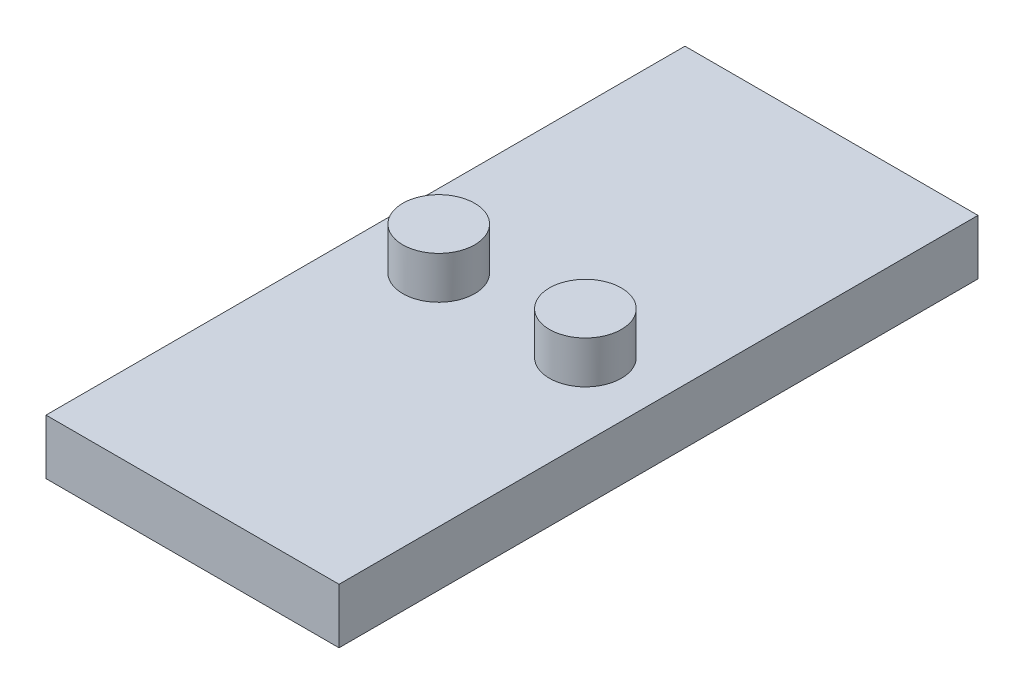
ISO-10303-21;
HEADER;
FILE_DESCRIPTION(('STEP AP214'),'2;1');
FILE_NAME('part.step','',(''),(''),'','','');
FILE_SCHEMA(('AUTOMOTIVE_DESIGN { 1 0 10303 214 1 1 1 1 }'));
ENDSEC;
DATA;
#1=APPLICATION_CONTEXT('core data for automotive mechanical design processes');
#2=APPLICATION_PROTOCOL_DEFINITION('international standard','automotive_design',2000,#1);
#3=PRODUCT_CONTEXT('',#1,'mechanical');
#4=PRODUCT('Part','Part','',(#3));
#5=PRODUCT_RELATED_PRODUCT_CATEGORY('part','',(#4));
#6=PRODUCT_DEFINITION_FORMATION('','',#4);
#7=PRODUCT_DEFINITION_CONTEXT('part definition',#1,'design');
#8=PRODUCT_DEFINITION('design','',#6,#7);
#9=PRODUCT_DEFINITION_SHAPE('','',#8);
#10=(LENGTH_UNIT() NAMED_UNIT(*) SI_UNIT(.MILLI.,.METRE.));
#11=(NAMED_UNIT(*) PLANE_ANGLE_UNIT() SI_UNIT($,.RADIAN.));
#12=(NAMED_UNIT(*) SI_UNIT($,.STERADIAN.) SOLID_ANGLE_UNIT());
#13=UNCERTAINTY_MEASURE_WITH_UNIT(LENGTH_MEASURE(1.E-05),#10,'distance_accuracy_value','');
#14=(GEOMETRIC_REPRESENTATION_CONTEXT(3) GLOBAL_UNCERTAINTY_ASSIGNED_CONTEXT((#13)) GLOBAL_UNIT_ASSIGNED_CONTEXT((#10,
#11,#12)) REPRESENTATION_CONTEXT('',''));
#15=CARTESIAN_POINT('',(0.,0.,0.));
#16=DIRECTION('',(0.,0.,1.));
#17=DIRECTION('',(1.,0.,0.));
#18=AXIS2_PLACEMENT_3D('',#15,#16,#17);
#19=CARTESIAN_POINT('',(-34.6,13.,-75.4420338051457));
#20=DIRECTION('',(1.,0.,0.));
#21=DIRECTION('',(0.,0.,-1.));
#22=AXIS2_PLACEMENT_3D('',#19,#20,#21);
#23=PLANE('',#22);
#24=DIRECTION('',(0.,0.,1.));
#25=VECTOR('',#24,1.);
#26=CARTESIAN_POINT('',(-34.6,0.,-75.4420338051457));
#27=LINE('',#26,#25);
#28=CARTESIAN_POINT('',(-34.6,0.,-75.4420338051457));
#29=VERTEX_POINT('',#28);
#30=CARTESIAN_POINT('',(-34.6,0.,75.4420338051457));
#31=VERTEX_POINT('',#30);
#32=EDGE_CURVE('E109',#29,#31,#27,.T.);
#33=ORIENTED_EDGE('',*,*,#32,.T.);
#34=DIRECTION('',(0.,-1.,0.));
#35=VECTOR('',#34,1.);
#36=CARTESIAN_POINT('',(-34.6,13.,75.4420338051457));
#37=LINE('',#36,#35);
#38=CARTESIAN_POINT('',(-34.6,13.,75.4420338051457));
#39=VERTEX_POINT('',#38);
#40=EDGE_CURVE('E100',#39,#31,#37,.T.);
#41=ORIENTED_EDGE('',*,*,#40,.F.);
#42=DIRECTION('',(0.,0.,1.));
#43=VECTOR('',#42,1.);
#44=CARTESIAN_POINT('',(-34.6,13.,-75.4420338051457));
#45=LINE('',#44,#43);
#46=CARTESIAN_POINT('',(-34.6,13.,-75.4420338051457));
#47=VERTEX_POINT('',#46);
#48=EDGE_CURVE('E94',#47,#39,#45,.T.);
#49=ORIENTED_EDGE('',*,*,#48,.F.);
#50=DIRECTION('',(0.,-1.,0.));
#51=VECTOR('',#50,1.);
#52=CARTESIAN_POINT('',(-34.6,13.,-75.4420338051457));
#53=LINE('',#52,#51);
#54=EDGE_CURVE('E105',#47,#29,#53,.T.);
#55=ORIENTED_EDGE('',*,*,#54,.T.);
#56=EDGE_LOOP('',(#33,#41,#49,#55));
#57=FACE_BOUND('',#56,.T.);
#58=ADVANCED_FACE('F42',(#57),#23,.F.);
#59=CARTESIAN_POINT('',(34.6,13.,75.4420338051457));
#60=DIRECTION('',(0.,0.,-1.));
#61=DIRECTION('',(-1.,0.,0.));
#62=AXIS2_PLACEMENT_3D('',#59,#60,#61);
#63=PLANE('',#62);
#64=DIRECTION('',(1.,0.,0.));
#65=VECTOR('',#64,1.);
#66=CARTESIAN_POINT('',(34.6,0.,75.4420338051457));
#67=LINE('',#66,#65);
#68=CARTESIAN_POINT('',(34.6,0.,75.4420338051457));
#69=VERTEX_POINT('',#68);
#70=EDGE_CURVE('E99',#31,#69,#67,.T.);
#71=ORIENTED_EDGE('',*,*,#70,.T.);
#72=DIRECTION('',(0.,-1.,0.));
#73=VECTOR('',#72,1.);
#74=CARTESIAN_POINT('',(34.6,13.,75.4420338051457));
#75=LINE('',#74,#73);
#76=CARTESIAN_POINT('',(34.6,13.,75.4420338051457));
#77=VERTEX_POINT('',#76);
#78=EDGE_CURVE('E97',#77,#69,#75,.T.);
#79=ORIENTED_EDGE('',*,*,#78,.F.);
#80=DIRECTION('',(1.,0.,0.));
#81=VECTOR('',#80,1.);
#82=CARTESIAN_POINT('',(34.6,13.,75.4420338051457));
#83=LINE('',#82,#81);
#84=EDGE_CURVE('E89',#39,#77,#83,.T.);
#85=ORIENTED_EDGE('',*,*,#84,.F.);
#86=ORIENTED_EDGE('',*,*,#40,.T.);
#87=EDGE_LOOP('',(#71,#79,#85,#86));
#88=FACE_BOUND('',#87,.T.);
#89=ADVANCED_FACE('F98',(#88),#63,.F.);
#90=CARTESIAN_POINT('',(34.6,13.,-75.4420338051457));
#91=DIRECTION('',(-1.,0.,0.));
#92=DIRECTION('',(0.,0.,1.));
#93=AXIS2_PLACEMENT_3D('',#90,#91,#92);
#94=PLANE('',#93);
#95=DIRECTION('',(0.,0.,-1.));
#96=VECTOR('',#95,1.);
#97=CARTESIAN_POINT('',(34.6,0.,-75.4420338051457));
#98=LINE('',#97,#96);
#99=CARTESIAN_POINT('',(34.6,0.,-75.4420338051457));
#100=VERTEX_POINT('',#99);
#101=EDGE_CURVE('E75',#69,#100,#98,.T.);
#102=ORIENTED_EDGE('',*,*,#101,.T.);
#103=DIRECTION('',(0.,-1.,0.));
#104=VECTOR('',#103,1.);
#105=CARTESIAN_POINT('',(34.6,13.,-75.4420338051457));
#106=LINE('',#105,#104);
#107=CARTESIAN_POINT('',(34.6,13.,-75.4420338051457));
#108=VERTEX_POINT('',#107);
#109=EDGE_CURVE('E101',#108,#100,#106,.T.);
#110=ORIENTED_EDGE('',*,*,#109,.F.);
#111=DIRECTION('',(0.,0.,-1.));
#112=VECTOR('',#111,1.);
#113=CARTESIAN_POINT('',(34.6,13.,-75.4420338051457));
#114=LINE('',#113,#112);
#115=EDGE_CURVE('E92',#77,#108,#114,.T.);
#116=ORIENTED_EDGE('',*,*,#115,.F.);
#117=ORIENTED_EDGE('',*,*,#78,.T.);
#118=EDGE_LOOP('',(#102,#110,#116,#117));
#119=FACE_BOUND('',#118,.T.);
#120=ADVANCED_FACE('F103',(#119),#94,.F.);
#121=CARTESIAN_POINT('',(34.6,13.,-75.4420338051457));
#122=DIRECTION('',(0.,0.,1.));
#123=DIRECTION('',(1.,0.,0.));
#124=AXIS2_PLACEMENT_3D('',#121,#122,#123);
#125=PLANE('',#124);
#126=DIRECTION('',(-1.,0.,0.));
#127=VECTOR('',#126,1.);
#128=CARTESIAN_POINT('',(34.6,0.,-75.4420338051457));
#129=LINE('',#128,#127);
#130=EDGE_CURVE('E81',#100,#29,#129,.T.);
#131=ORIENTED_EDGE('',*,*,#130,.T.);
#132=ORIENTED_EDGE('',*,*,#54,.F.);
#133=DIRECTION('',(-1.,0.,0.));
#134=VECTOR('',#133,1.);
#135=CARTESIAN_POINT('',(34.6,13.,-75.4420338051457));
#136=LINE('',#135,#134);
#137=EDGE_CURVE('E58',#108,#47,#136,.T.);
#138=ORIENTED_EDGE('',*,*,#137,.F.);
#139=ORIENTED_EDGE('',*,*,#109,.T.);
#140=EDGE_LOOP('',(#131,#132,#138,#139));
#141=FACE_BOUND('',#140,.T.);
#142=ADVANCED_FACE('F125',(#141),#125,.F.);
#143=CARTESIAN_POINT('',(0.,13.,0.));
#144=DIRECTION('',(0.,-1.,0.));
#145=DIRECTION('',(0.,0.,-1.));
#146=AXIS2_PLACEMENT_3D('',#143,#144,#145);
#147=PLANE('',#146);
#148=CARTESIAN_POINT('',(-17.3,13.,0.));
#149=DIRECTION('',(0.,-1.,0.));
#150=DIRECTION('',(0.,0.,-1.));
#151=AXIS2_PLACEMENT_3D('',#148,#149,#150);
#152=CIRCLE('',#151,8.495);
#153=CARTESIAN_POINT('',(-17.3,13.,-8.49499999999999));
#154=VERTEX_POINT('',#153);
#155=EDGE_CURVE('E12',#154,#154,#152,.F.);
#156=ORIENTED_EDGE('',*,*,#155,.F.);
#157=EDGE_LOOP('',(#156));
#158=FACE_BOUND('',#157,.T.);
#159=CARTESIAN_POINT('',(17.3251182214965,13.,-0.00925204028589394));
#160=DIRECTION('',(0.,-1.,0.));
#161=DIRECTION('',(0.,0.,-1.));
#162=AXIS2_PLACEMENT_3D('',#159,#160,#161);
#163=CIRCLE('',#162,8.495);
#164=CARTESIAN_POINT('',(17.3251182214965,13.,-8.50425204028589));
#165=VERTEX_POINT('',#164);
#166=EDGE_CURVE('E50',#165,#165,#163,.F.);
#167=ORIENTED_EDGE('',*,*,#166,.F.);
#168=EDGE_LOOP('',(#167));
#169=FACE_BOUND('',#168,.T.);
#170=ORIENTED_EDGE('',*,*,#48,.T.);
#171=ORIENTED_EDGE('',*,*,#84,.T.);
#172=ORIENTED_EDGE('',*,*,#115,.T.);
#173=ORIENTED_EDGE('',*,*,#137,.T.);
#174=EDGE_LOOP('',(#170,#171,#172,#173));
#175=FACE_BOUND('',#174,.T.);
#176=ADVANCED_FACE('F90',(#158,#169,#175),#147,.F.);
#177=CARTESIAN_POINT('',(0.,0.,0.));
#178=DIRECTION('',(0.,-1.,0.));
#179=DIRECTION('',(0.,0.,-1.));
#180=AXIS2_PLACEMENT_3D('',#177,#178,#179);
#181=PLANE('',#180);
#182=ORIENTED_EDGE('',*,*,#32,.F.);
#183=ORIENTED_EDGE('',*,*,#130,.F.);
#184=ORIENTED_EDGE('',*,*,#101,.F.);
#185=ORIENTED_EDGE('',*,*,#70,.F.);
#186=EDGE_LOOP('',(#182,#183,#184,#185));
#187=FACE_BOUND('',#186,.T.);
#188=ADVANCED_FACE('F124',(#187),#181,.T.);
#189=CARTESIAN_POINT('',(17.3251182214965,23.,-0.00925204028589394));
#190=DIRECTION('',(0.,-1.,0.));
#191=DIRECTION('',(0.,0.,-1.));
#192=AXIS2_PLACEMENT_3D('',#189,#190,#191);
#193=CYLINDRICAL_SURFACE('',#192,8.495);
#194=CARTESIAN_POINT('',(17.3251182214965,23.,-0.00925204028589394));
#195=DIRECTION('',(0.,1.,0.));
#196=DIRECTION('',(0.,0.,1.));
#197=AXIS2_PLACEMENT_3D('',#194,#195,#196);
#198=CIRCLE('',#197,8.495);
#199=CARTESIAN_POINT('',(17.3251182214965,23.,8.48574795971411));
#200=VERTEX_POINT('',#199);
#201=EDGE_CURVE('E112',#200,#200,#198,.T.);
#202=ORIENTED_EDGE('',*,*,#201,.F.);
#203=EDGE_LOOP('',(#202));
#204=FACE_BOUND('',#203,.T.);
#205=ORIENTED_EDGE('',*,*,#166,.T.);
#206=EDGE_LOOP('',(#205));
#207=FACE_BOUND('',#206,.T.);
#208=ADVANCED_FACE('F121',(#204,#207),#193,.T.);
#209=CARTESIAN_POINT('',(0.,23.,0.));
#210=DIRECTION('',(0.,1.,0.));
#211=DIRECTION('',(0.,0.,1.));
#212=AXIS2_PLACEMENT_3D('',#209,#210,#211);
#213=PLANE('',#212);
#214=ORIENTED_EDGE('',*,*,#201,.T.);
#215=EDGE_LOOP('',(#214));
#216=FACE_BOUND('',#215,.T.);
#217=ADVANCED_FACE('F154',(#216),#213,.T.);
#218=CARTESIAN_POINT('',(-17.3,23.,0.));
#219=DIRECTION('',(0.,-1.,0.));
#220=DIRECTION('',(0.,0.,-1.));
#221=AXIS2_PLACEMENT_3D('',#218,#219,#220);
#222=CYLINDRICAL_SURFACE('',#221,8.495);
#223=ORIENTED_EDGE('',*,*,#155,.T.);
#224=EDGE_LOOP('',(#223));
#225=FACE_BOUND('',#224,.T.);
#226=CARTESIAN_POINT('',(-17.3,23.,0.));
#227=DIRECTION('',(0.,1.,0.));
#228=DIRECTION('',(0.,0.,1.));
#229=AXIS2_PLACEMENT_3D('',#226,#227,#228);
#230=CIRCLE('',#229,8.495);
#231=CARTESIAN_POINT('',(-17.3,23.,8.49500000000001));
#232=VERTEX_POINT('',#231);
#233=EDGE_CURVE('E146',#232,#232,#230,.T.);
#234=ORIENTED_EDGE('',*,*,#233,.F.);
#235=EDGE_LOOP('',(#234));
#236=FACE_BOUND('',#235,.T.);
#237=ADVANCED_FACE('F152',(#225,#236),#222,.T.);
#238=CARTESIAN_POINT('',(0.,23.,0.));
#239=DIRECTION('',(0.,1.,0.));
#240=DIRECTION('',(0.,0.,1.));
#241=AXIS2_PLACEMENT_3D('',#238,#239,#240);
#242=PLANE('',#241);
#243=ORIENTED_EDGE('',*,*,#233,.T.);
#244=EDGE_LOOP('',(#243));
#245=FACE_BOUND('',#244,.T.);
#246=ADVANCED_FACE('F150',(#245),#242,.T.);
#247=CLOSED_SHELL('',(#58,#89,#120,#142,#176,#188,#208,#217,#237,#246));
#248=MANIFOLD_SOLID_BREP('B2',#247);
#249=ADVANCED_BREP_SHAPE_REPRESENTATION('',(#18,#248),#14);
#250=SHAPE_DEFINITION_REPRESENTATION(#9,#249);
ENDSEC;
END-ISO-10303-21;
